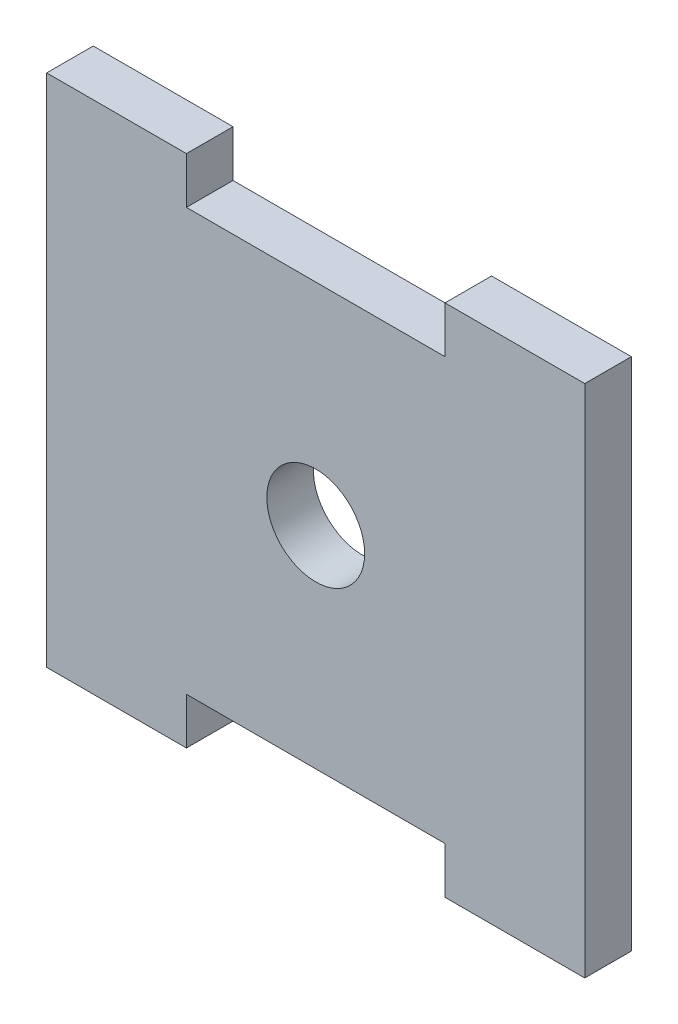
ISO-10303-21;
HEADER;
FILE_DESCRIPTION(('STEP AP214'),'2;1');
FILE_NAME('part.step','',(''),(''),'','','');
FILE_SCHEMA(('AUTOMOTIVE_DESIGN { 1 0 10303 214 1 1 1 1 }'));
ENDSEC;
DATA;
#1=APPLICATION_CONTEXT('core data for automotive mechanical design processes');
#2=APPLICATION_PROTOCOL_DEFINITION('international standard','automotive_design',2000,#1);
#3=PRODUCT_CONTEXT('',#1,'mechanical');
#4=PRODUCT('Part','Part','',(#3));
#5=PRODUCT_RELATED_PRODUCT_CATEGORY('part','',(#4));
#6=PRODUCT_DEFINITION_FORMATION('','',#4);
#7=PRODUCT_DEFINITION_CONTEXT('part definition',#1,'design');
#8=PRODUCT_DEFINITION('design','',#6,#7);
#9=PRODUCT_DEFINITION_SHAPE('','',#8);
#10=(LENGTH_UNIT() NAMED_UNIT(*) SI_UNIT(.MILLI.,.METRE.));
#11=(NAMED_UNIT(*) PLANE_ANGLE_UNIT() SI_UNIT($,.RADIAN.));
#12=(NAMED_UNIT(*) SI_UNIT($,.STERADIAN.) SOLID_ANGLE_UNIT());
#13=UNCERTAINTY_MEASURE_WITH_UNIT(LENGTH_MEASURE(1.E-05),#10,'distance_accuracy_value','');
#14=(GEOMETRIC_REPRESENTATION_CONTEXT(3) GLOBAL_UNCERTAINTY_ASSIGNED_CONTEXT((#13)) GLOBAL_UNIT_ASSIGNED_CONTEXT((#10,
#11,#12)) REPRESENTATION_CONTEXT('',''));
#15=CARTESIAN_POINT('',(0.,0.,0.));
#16=DIRECTION('',(0.,0.,1.));
#17=DIRECTION('',(1.,0.,0.));
#18=AXIS2_PLACEMENT_3D('',#15,#16,#17);
#19=CARTESIAN_POINT('',(0.,0.,2.));
#20=DIRECTION('',(0.,0.,-1.));
#21=DIRECTION('',(-1.,0.,0.));
#22=AXIS2_PLACEMENT_3D('',#19,#20,#21);
#23=PLANE('',#22);
#24=DIRECTION('',(-1.,0.,0.));
#25=VECTOR('',#24,1.);
#26=CARTESIAN_POINT('',(3.,-1.,2.));
#27=LINE('',#26,#25);
#28=CARTESIAN_POINT('',(14.1,-1.,2.));
#29=VERTEX_POINT('',#28);
#30=CARTESIAN_POINT('',(3.,-1.,2.));
#31=VERTEX_POINT('',#30);
#32=EDGE_CURVE('E180',#29,#31,#27,.T.);
#33=ORIENTED_EDGE('',*,*,#32,.T.);
#34=DIRECTION('',(0.,1.,0.));
#35=VECTOR('',#34,1.);
#36=CARTESIAN_POINT('',(3.,0.999999999999999,2.));
#37=LINE('',#36,#35);
#38=CARTESIAN_POINT('',(3.,0.999999999999999,2.));
#39=VERTEX_POINT('',#38);
#40=EDGE_CURVE('E107',#31,#39,#37,.T.);
#41=ORIENTED_EDGE('',*,*,#40,.T.);
#42=DIRECTION('',(-1.,0.,0.));
#43=VECTOR('',#42,1.);
#44=CARTESIAN_POINT('',(-3.,0.999999999999999,2.));
#45=LINE('',#44,#43);
#46=CARTESIAN_POINT('',(-3.,0.999999999999999,2.));
#47=VERTEX_POINT('',#46);
#48=EDGE_CURVE('E207',#39,#47,#45,.T.);
#49=ORIENTED_EDGE('',*,*,#48,.T.);
#50=DIRECTION('',(0.,-1.,0.));
#51=VECTOR('',#50,1.);
#52=CARTESIAN_POINT('',(-3.,0.999999999999999,2.));
#53=LINE('',#52,#51);
#54=CARTESIAN_POINT('',(-3.,-21.1,2.));
#55=VERTEX_POINT('',#54);
#56=EDGE_CURVE('E225',#47,#55,#53,.T.);
#57=ORIENTED_EDGE('',*,*,#56,.T.);
#58=DIRECTION('',(1.,0.,0.));
#59=VECTOR('',#58,1.);
#60=CARTESIAN_POINT('',(-3.,-21.1,2.));
#61=LINE('',#60,#59);
#62=CARTESIAN_POINT('',(3.,-21.1,2.));
#63=VERTEX_POINT('',#62);
#64=EDGE_CURVE('E222',#55,#63,#61,.T.);
#65=ORIENTED_EDGE('',*,*,#64,.T.);
#66=DIRECTION('',(0.,1.,0.));
#67=VECTOR('',#66,1.);
#68=CARTESIAN_POINT('',(3.,-21.1,2.));
#69=LINE('',#68,#67);
#70=CARTESIAN_POINT('',(3.,-19.1,2.));
#71=VERTEX_POINT('',#70);
#72=EDGE_CURVE('E224',#63,#71,#69,.T.);
#73=ORIENTED_EDGE('',*,*,#72,.T.);
#74=DIRECTION('',(1.,0.,0.));
#75=VECTOR('',#74,1.);
#76=CARTESIAN_POINT('',(3.,-19.1,2.));
#77=LINE('',#76,#75);
#78=CARTESIAN_POINT('',(14.1,-19.1,2.));
#79=VERTEX_POINT('',#78);
#80=EDGE_CURVE('E227',#71,#79,#77,.T.);
#81=ORIENTED_EDGE('',*,*,#80,.T.);
#82=DIRECTION('',(0.,-1.,0.));
#83=VECTOR('',#82,1.);
#84=CARTESIAN_POINT('',(14.1,-21.1,2.));
#85=LINE('',#84,#83);
#86=CARTESIAN_POINT('',(14.1,-21.1,2.));
#87=VERTEX_POINT('',#86);
#88=EDGE_CURVE('E233',#79,#87,#85,.T.);
#89=ORIENTED_EDGE('',*,*,#88,.T.);
#90=DIRECTION('',(1.,0.,0.));
#91=VECTOR('',#90,1.);
#92=CARTESIAN_POINT('',(20.1,-21.1,2.));
#93=LINE('',#92,#91);
#94=CARTESIAN_POINT('',(20.1,-21.1,2.));
#95=VERTEX_POINT('',#94);
#96=EDGE_CURVE('E138',#87,#95,#93,.T.);
#97=ORIENTED_EDGE('',*,*,#96,.T.);
#98=DIRECTION('',(0.,1.,0.));
#99=VECTOR('',#98,1.);
#100=CARTESIAN_POINT('',(20.1,-21.1,2.));
#101=LINE('',#100,#99);
#102=CARTESIAN_POINT('',(20.1,0.999999999999999,2.));
#103=VERTEX_POINT('',#102);
#104=EDGE_CURVE('E132',#95,#103,#101,.T.);
#105=ORIENTED_EDGE('',*,*,#104,.T.);
#106=DIRECTION('',(-1.,0.,0.));
#107=VECTOR('',#106,1.);
#108=CARTESIAN_POINT('',(20.1,0.999999999999999,2.));
#109=LINE('',#108,#107);
#110=CARTESIAN_POINT('',(14.1,0.999999999999999,2.));
#111=VERTEX_POINT('',#110);
#112=EDGE_CURVE('E136',#103,#111,#109,.T.);
#113=ORIENTED_EDGE('',*,*,#112,.T.);
#114=DIRECTION('',(0.,-1.,0.));
#115=VECTOR('',#114,1.);
#116=CARTESIAN_POINT('',(14.1,0.999999999999999,2.));
#117=LINE('',#116,#115);
#118=EDGE_CURVE('E52',#111,#29,#117,.T.);
#119=ORIENTED_EDGE('',*,*,#118,.T.);
#120=EDGE_LOOP('',(#33,#41,#49,#57,#65,#73,#81,#89,#97,#105,#113,#119));
#121=FACE_BOUND('',#120,.T.);
#122=CARTESIAN_POINT('',(8.55,-10.05,2.));
#123=DIRECTION('',(0.,0.,1.));
#124=DIRECTION('',(1.,0.,0.));
#125=AXIS2_PLACEMENT_3D('',#122,#123,#124);
#126=CIRCLE('',#125,2.1);
#127=CARTESIAN_POINT('',(10.65,-10.05,2.));
#128=VERTEX_POINT('',#127);
#129=EDGE_CURVE('E159',#128,#128,#126,.T.);
#130=ORIENTED_EDGE('',*,*,#129,.F.);
#131=EDGE_LOOP('',(#130));
#132=FACE_BOUND('',#131,.T.);
#133=ADVANCED_FACE('F35',(#121,#132),#23,.F.);
#134=CARTESIAN_POINT('',(0.,0.,0.));
#135=DIRECTION('',(0.,0.,-1.));
#136=DIRECTION('',(-1.,0.,0.));
#137=AXIS2_PLACEMENT_3D('',#134,#135,#136);
#138=PLANE('',#137);
#139=DIRECTION('',(-1.,0.,0.));
#140=VECTOR('',#139,1.);
#141=CARTESIAN_POINT('',(3.,-1.,0.));
#142=LINE('',#141,#140);
#143=CARTESIAN_POINT('',(14.1,-1.,0.));
#144=VERTEX_POINT('',#143);
#145=CARTESIAN_POINT('',(3.,-1.,0.));
#146=VERTEX_POINT('',#145);
#147=EDGE_CURVE('E155',#144,#146,#142,.T.);
#148=ORIENTED_EDGE('',*,*,#147,.F.);
#149=DIRECTION('',(0.,-1.,0.));
#150=VECTOR('',#149,1.);
#151=CARTESIAN_POINT('',(14.1,0.999999999999999,0.));
#152=LINE('',#151,#150);
#153=CARTESIAN_POINT('',(14.1,0.999999999999999,0.));
#154=VERTEX_POINT('',#153);
#155=EDGE_CURVE('E99',#154,#144,#152,.T.);
#156=ORIENTED_EDGE('',*,*,#155,.F.);
#157=DIRECTION('',(-1.,0.,0.));
#158=VECTOR('',#157,1.);
#159=CARTESIAN_POINT('',(20.1,0.999999999999999,0.));
#160=LINE('',#159,#158);
#161=CARTESIAN_POINT('',(20.1,0.999999999999999,0.));
#162=VERTEX_POINT('',#161);
#163=EDGE_CURVE('E93',#162,#154,#160,.T.);
#164=ORIENTED_EDGE('',*,*,#163,.F.);
#165=DIRECTION('',(0.,1.,0.));
#166=VECTOR('',#165,1.);
#167=CARTESIAN_POINT('',(20.1,0.999999999999999,0.));
#168=LINE('',#167,#166);
#169=CARTESIAN_POINT('',(20.1,-21.1,0.));
#170=VERTEX_POINT('',#169);
#171=EDGE_CURVE('E145',#170,#162,#168,.T.);
#172=ORIENTED_EDGE('',*,*,#171,.F.);
#173=DIRECTION('',(1.,0.,0.));
#174=VECTOR('',#173,1.);
#175=CARTESIAN_POINT('',(20.1,-21.1,0.));
#176=LINE('',#175,#174);
#177=CARTESIAN_POINT('',(14.1,-21.1,0.));
#178=VERTEX_POINT('',#177);
#179=EDGE_CURVE('E174',#178,#170,#176,.T.);
#180=ORIENTED_EDGE('',*,*,#179,.F.);
#181=DIRECTION('',(0.,-1.,0.));
#182=VECTOR('',#181,1.);
#183=CARTESIAN_POINT('',(14.1,-21.1,0.));
#184=LINE('',#183,#182);
#185=CARTESIAN_POINT('',(14.1,-19.1,0.));
#186=VERTEX_POINT('',#185);
#187=EDGE_CURVE('E172',#186,#178,#184,.T.);
#188=ORIENTED_EDGE('',*,*,#187,.F.);
#189=DIRECTION('',(1.,0.,0.));
#190=VECTOR('',#189,1.);
#191=CARTESIAN_POINT('',(3.,-19.1,0.));
#192=LINE('',#191,#190);
#193=CARTESIAN_POINT('',(3.,-19.1,0.));
#194=VERTEX_POINT('',#193);
#195=EDGE_CURVE('E170',#194,#186,#192,.T.);
#196=ORIENTED_EDGE('',*,*,#195,.F.);
#197=DIRECTION('',(0.,1.,0.));
#198=VECTOR('',#197,1.);
#199=CARTESIAN_POINT('',(3.,-21.1,0.));
#200=LINE('',#199,#198);
#201=CARTESIAN_POINT('',(3.,-21.1,0.));
#202=VERTEX_POINT('',#201);
#203=EDGE_CURVE('E168',#202,#194,#200,.T.);
#204=ORIENTED_EDGE('',*,*,#203,.F.);
#205=DIRECTION('',(1.,0.,0.));
#206=VECTOR('',#205,1.);
#207=CARTESIAN_POINT('',(-3.,-21.1,0.));
#208=LINE('',#207,#206);
#209=CARTESIAN_POINT('',(-3.,-21.1,0.));
#210=VERTEX_POINT('',#209);
#211=EDGE_CURVE('E166',#210,#202,#208,.T.);
#212=ORIENTED_EDGE('',*,*,#211,.F.);
#213=DIRECTION('',(0.,-1.,0.));
#214=VECTOR('',#213,1.);
#215=CARTESIAN_POINT('',(-3.,-21.1,0.));
#216=LINE('',#215,#214);
#217=CARTESIAN_POINT('',(-3.,0.999999999999999,0.));
#218=VERTEX_POINT('',#217);
#219=EDGE_CURVE('E164',#218,#210,#216,.T.);
#220=ORIENTED_EDGE('',*,*,#219,.F.);
#221=DIRECTION('',(-1.,0.,0.));
#222=VECTOR('',#221,1.);
#223=CARTESIAN_POINT('',(-3.,0.999999999999999,0.));
#224=LINE('',#223,#222);
#225=CARTESIAN_POINT('',(3.,0.999999999999999,0.));
#226=VERTEX_POINT('',#225);
#227=EDGE_CURVE('E161',#226,#218,#224,.T.);
#228=ORIENTED_EDGE('',*,*,#227,.F.);
#229=DIRECTION('',(0.,1.,0.));
#230=VECTOR('',#229,1.);
#231=CARTESIAN_POINT('',(3.,0.999999999999999,0.));
#232=LINE('',#231,#230);
#233=EDGE_CURVE('E158',#146,#226,#232,.T.);
#234=ORIENTED_EDGE('',*,*,#233,.F.);
#235=EDGE_LOOP('',(#148,#156,#164,#172,#180,#188,#196,#204,#212,#220,#228,#234));
#236=FACE_BOUND('',#235,.T.);
#237=CARTESIAN_POINT('',(8.55,-10.05,0.));
#238=DIRECTION('',(0.,0.,1.));
#239=DIRECTION('',(1.,0.,0.));
#240=AXIS2_PLACEMENT_3D('',#237,#238,#239);
#241=CIRCLE('',#240,2.1);
#242=CARTESIAN_POINT('',(10.65,-10.05,0.));
#243=VERTEX_POINT('',#242);
#244=EDGE_CURVE('E392',#243,#243,#241,.T.);
#245=ORIENTED_EDGE('',*,*,#244,.T.);
#246=EDGE_LOOP('',(#245));
#247=FACE_BOUND('',#246,.T.);
#248=ADVANCED_FACE('F210',(#236,#247),#138,.T.);
#249=CARTESIAN_POINT('',(3.,-1.,2.));
#250=DIRECTION('',(0.,-1.,0.));
#251=DIRECTION('',(0.,0.,-1.));
#252=AXIS2_PLACEMENT_3D('',#249,#250,#251);
#253=PLANE('',#252);
#254=ORIENTED_EDGE('',*,*,#147,.T.);
#255=DIRECTION('',(0.,0.,-1.));
#256=VECTOR('',#255,1.);
#257=CARTESIAN_POINT('',(3.,-1.,2.));
#258=LINE('',#257,#256);
#259=EDGE_CURVE('E11',#31,#146,#258,.T.);
#260=ORIENTED_EDGE('',*,*,#259,.F.);
#261=ORIENTED_EDGE('',*,*,#32,.F.);
#262=DIRECTION('',(0.,0.,-1.));
#263=VECTOR('',#262,1.);
#264=CARTESIAN_POINT('',(14.1,-1.,2.));
#265=LINE('',#264,#263);
#266=EDGE_CURVE('E151',#29,#144,#265,.T.);
#267=ORIENTED_EDGE('',*,*,#266,.T.);
#268=EDGE_LOOP('',(#254,#260,#261,#267));
#269=FACE_BOUND('',#268,.T.);
#270=ADVANCED_FACE('F37',(#269),#253,.F.);
#271=CARTESIAN_POINT('',(3.,0.999999999999999,2.));
#272=DIRECTION('',(-1.,0.,0.));
#273=DIRECTION('',(0.,-1.,0.));
#274=AXIS2_PLACEMENT_3D('',#271,#272,#273);
#275=PLANE('',#274);
#276=ORIENTED_EDGE('',*,*,#233,.T.);
#277=DIRECTION('',(0.,0.,-1.));
#278=VECTOR('',#277,1.);
#279=CARTESIAN_POINT('',(3.,0.999999999999999,2.));
#280=LINE('',#279,#278);
#281=EDGE_CURVE('E44',#39,#226,#280,.T.);
#282=ORIENTED_EDGE('',*,*,#281,.F.);
#283=ORIENTED_EDGE('',*,*,#40,.F.);
#284=ORIENTED_EDGE('',*,*,#259,.T.);
#285=EDGE_LOOP('',(#276,#282,#283,#284));
#286=FACE_BOUND('',#285,.T.);
#287=ADVANCED_FACE('F268',(#286),#275,.F.);
#288=CARTESIAN_POINT('',(-3.,0.999999999999999,2.));
#289=DIRECTION('',(0.,-1.,0.));
#290=DIRECTION('',(0.,0.,-1.));
#291=AXIS2_PLACEMENT_3D('',#288,#289,#290);
#292=PLANE('',#291);
#293=ORIENTED_EDGE('',*,*,#227,.T.);
#294=DIRECTION('',(0.,0.,-1.));
#295=VECTOR('',#294,1.);
#296=CARTESIAN_POINT('',(-3.,0.999999999999999,2.));
#297=LINE('',#296,#295);
#298=EDGE_CURVE('E199',#47,#218,#297,.T.);
#299=ORIENTED_EDGE('',*,*,#298,.F.);
#300=ORIENTED_EDGE('',*,*,#48,.F.);
#301=ORIENTED_EDGE('',*,*,#281,.T.);
#302=EDGE_LOOP('',(#293,#299,#300,#301));
#303=FACE_BOUND('',#302,.T.);
#304=ADVANCED_FACE('F205',(#303),#292,.F.);
#305=CARTESIAN_POINT('',(-3.,-21.1,2.));
#306=DIRECTION('',(1.,0.,0.));
#307=DIRECTION('',(0.,1.,0.));
#308=AXIS2_PLACEMENT_3D('',#305,#306,#307);
#309=PLANE('',#308);
#310=ORIENTED_EDGE('',*,*,#219,.T.);
#311=DIRECTION('',(0.,0.,-1.));
#312=VECTOR('',#311,1.);
#313=CARTESIAN_POINT('',(-3.,-21.1,2.));
#314=LINE('',#313,#312);
#315=EDGE_CURVE('E196',#55,#210,#314,.T.);
#316=ORIENTED_EDGE('',*,*,#315,.F.);
#317=ORIENTED_EDGE('',*,*,#56,.F.);
#318=ORIENTED_EDGE('',*,*,#298,.T.);
#319=EDGE_LOOP('',(#310,#316,#317,#318));
#320=FACE_BOUND('',#319,.T.);
#321=ADVANCED_FACE('F216',(#320),#309,.F.);
#322=CARTESIAN_POINT('',(-3.,-21.1,2.));
#323=DIRECTION('',(0.,1.,0.));
#324=DIRECTION('',(0.,0.,1.));
#325=AXIS2_PLACEMENT_3D('',#322,#323,#324);
#326=PLANE('',#325);
#327=ORIENTED_EDGE('',*,*,#211,.T.);
#328=DIRECTION('',(0.,0.,-1.));
#329=VECTOR('',#328,1.);
#330=CARTESIAN_POINT('',(3.,-21.1,2.));
#331=LINE('',#330,#329);
#332=EDGE_CURVE('E193',#63,#202,#331,.T.);
#333=ORIENTED_EDGE('',*,*,#332,.F.);
#334=ORIENTED_EDGE('',*,*,#64,.F.);
#335=ORIENTED_EDGE('',*,*,#315,.T.);
#336=EDGE_LOOP('',(#327,#333,#334,#335));
#337=FACE_BOUND('',#336,.T.);
#338=ADVANCED_FACE('F220',(#337),#326,.F.);
#339=CARTESIAN_POINT('',(3.,-21.1,2.));
#340=DIRECTION('',(-1.,0.,0.));
#341=DIRECTION('',(0.,0.,1.));
#342=AXIS2_PLACEMENT_3D('',#339,#340,#341);
#343=PLANE('',#342);
#344=ORIENTED_EDGE('',*,*,#203,.T.);
#345=DIRECTION('',(0.,0.,-1.));
#346=VECTOR('',#345,1.);
#347=CARTESIAN_POINT('',(3.,-19.1,2.));
#348=LINE('',#347,#346);
#349=EDGE_CURVE('E190',#71,#194,#348,.T.);
#350=ORIENTED_EDGE('',*,*,#349,.F.);
#351=ORIENTED_EDGE('',*,*,#72,.F.);
#352=ORIENTED_EDGE('',*,*,#332,.T.);
#353=EDGE_LOOP('',(#344,#350,#351,#352));
#354=FACE_BOUND('',#353,.T.);
#355=ADVANCED_FACE('F281',(#354),#343,.F.);
#356=CARTESIAN_POINT('',(3.,-19.1,2.));
#357=DIRECTION('',(0.,1.,0.));
#358=DIRECTION('',(0.,0.,1.));
#359=AXIS2_PLACEMENT_3D('',#356,#357,#358);
#360=PLANE('',#359);
#361=ORIENTED_EDGE('',*,*,#195,.T.);
#362=DIRECTION('',(0.,0.,-1.));
#363=VECTOR('',#362,1.);
#364=CARTESIAN_POINT('',(14.1,-19.1,2.));
#365=LINE('',#364,#363);
#366=EDGE_CURVE('E187',#79,#186,#365,.T.);
#367=ORIENTED_EDGE('',*,*,#366,.F.);
#368=ORIENTED_EDGE('',*,*,#80,.F.);
#369=ORIENTED_EDGE('',*,*,#349,.T.);
#370=EDGE_LOOP('',(#361,#367,#368,#369));
#371=FACE_BOUND('',#370,.T.);
#372=ADVANCED_FACE('F284',(#371),#360,.F.);
#373=CARTESIAN_POINT('',(14.1,-21.1,2.));
#374=DIRECTION('',(1.,0.,0.));
#375=DIRECTION('',(0.,0.,-1.));
#376=AXIS2_PLACEMENT_3D('',#373,#374,#375);
#377=PLANE('',#376);
#378=ORIENTED_EDGE('',*,*,#187,.T.);
#379=DIRECTION('',(0.,0.,-1.));
#380=VECTOR('',#379,1.);
#381=CARTESIAN_POINT('',(14.1,-21.1,2.));
#382=LINE('',#381,#380);
#383=EDGE_CURVE('E184',#87,#178,#382,.T.);
#384=ORIENTED_EDGE('',*,*,#383,.F.);
#385=ORIENTED_EDGE('',*,*,#88,.F.);
#386=ORIENTED_EDGE('',*,*,#366,.T.);
#387=EDGE_LOOP('',(#378,#384,#385,#386));
#388=FACE_BOUND('',#387,.T.);
#389=ADVANCED_FACE('F239',(#388),#377,.F.);
#390=CARTESIAN_POINT('',(20.1,-21.1,2.));
#391=DIRECTION('',(0.,1.,0.));
#392=DIRECTION('',(0.,0.,1.));
#393=AXIS2_PLACEMENT_3D('',#390,#391,#392);
#394=PLANE('',#393);
#395=ORIENTED_EDGE('',*,*,#179,.T.);
#396=DIRECTION('',(0.,0.,-1.));
#397=VECTOR('',#396,1.);
#398=CARTESIAN_POINT('',(20.1,-21.1,2.));
#399=LINE('',#398,#397);
#400=EDGE_CURVE('E146',#95,#170,#399,.T.);
#401=ORIENTED_EDGE('',*,*,#400,.F.);
#402=ORIENTED_EDGE('',*,*,#96,.F.);
#403=ORIENTED_EDGE('',*,*,#383,.T.);
#404=EDGE_LOOP('',(#395,#401,#402,#403));
#405=FACE_BOUND('',#404,.T.);
#406=ADVANCED_FACE('F243',(#405),#394,.F.);
#407=CARTESIAN_POINT('',(20.1,0.999999999999999,2.));
#408=DIRECTION('',(-1.,0.,0.));
#409=DIRECTION('',(0.,0.,1.));
#410=AXIS2_PLACEMENT_3D('',#407,#408,#409);
#411=PLANE('',#410);
#412=ORIENTED_EDGE('',*,*,#171,.T.);
#413=DIRECTION('',(0.,0.,-1.));
#414=VECTOR('',#413,1.);
#415=CARTESIAN_POINT('',(20.1,0.999999999999999,2.));
#416=LINE('',#415,#414);
#417=EDGE_CURVE('E143',#103,#162,#416,.T.);
#418=ORIENTED_EDGE('',*,*,#417,.F.);
#419=ORIENTED_EDGE('',*,*,#104,.F.);
#420=ORIENTED_EDGE('',*,*,#400,.T.);
#421=EDGE_LOOP('',(#412,#418,#419,#420));
#422=FACE_BOUND('',#421,.T.);
#423=ADVANCED_FACE('F144',(#422),#411,.F.);
#424=CARTESIAN_POINT('',(20.1,0.999999999999999,2.));
#425=DIRECTION('',(0.,-1.,0.));
#426=DIRECTION('',(0.,0.,-1.));
#427=AXIS2_PLACEMENT_3D('',#424,#425,#426);
#428=PLANE('',#427);
#429=ORIENTED_EDGE('',*,*,#163,.T.);
#430=DIRECTION('',(0.,0.,-1.));
#431=VECTOR('',#430,1.);
#432=CARTESIAN_POINT('',(14.1,0.999999999999999,2.));
#433=LINE('',#432,#431);
#434=EDGE_CURVE('E147',#111,#154,#433,.T.);
#435=ORIENTED_EDGE('',*,*,#434,.F.);
#436=ORIENTED_EDGE('',*,*,#112,.F.);
#437=ORIENTED_EDGE('',*,*,#417,.T.);
#438=EDGE_LOOP('',(#429,#435,#436,#437));
#439=FACE_BOUND('',#438,.T.);
#440=ADVANCED_FACE('F149',(#439),#428,.F.);
#441=CARTESIAN_POINT('',(14.1,0.999999999999999,2.));
#442=DIRECTION('',(1.,0.,0.));
#443=DIRECTION('',(0.,0.,-1.));
#444=AXIS2_PLACEMENT_3D('',#441,#442,#443);
#445=PLANE('',#444);
#446=ORIENTED_EDGE('',*,*,#155,.T.);
#447=ORIENTED_EDGE('',*,*,#266,.F.);
#448=ORIENTED_EDGE('',*,*,#118,.F.);
#449=ORIENTED_EDGE('',*,*,#434,.T.);
#450=EDGE_LOOP('',(#446,#447,#448,#449));
#451=FACE_BOUND('',#450,.T.);
#452=ADVANCED_FACE('F248',(#451),#445,.F.);
#453=CARTESIAN_POINT('',(8.55,-10.05,2.));
#454=DIRECTION('',(0.,0.,-1.));
#455=DIRECTION('',(-1.,0.,0.));
#456=AXIS2_PLACEMENT_3D('',#453,#454,#455);
#457=CYLINDRICAL_SURFACE('',#456,2.1);
#458=ORIENTED_EDGE('',*,*,#129,.T.);
#459=EDGE_LOOP('',(#458));
#460=FACE_BOUND('',#459,.T.);
#461=ORIENTED_EDGE('',*,*,#244,.F.);
#462=EDGE_LOOP('',(#461));
#463=FACE_BOUND('',#462,.T.);
#464=ADVANCED_FACE('F250',(#460,#463),#457,.F.);
#465=CLOSED_SHELL('',(#133,#248,#270,#287,#304,#321,#338,#355,#372,#389,#406,#423,#440,#452,#464));
#466=MANIFOLD_SOLID_BREP('B2',#465);
#467=ADVANCED_BREP_SHAPE_REPRESENTATION('',(#18,#466),#14);
#468=SHAPE_DEFINITION_REPRESENTATION(#9,#467);
ENDSEC;
END-ISO-10303-21;
